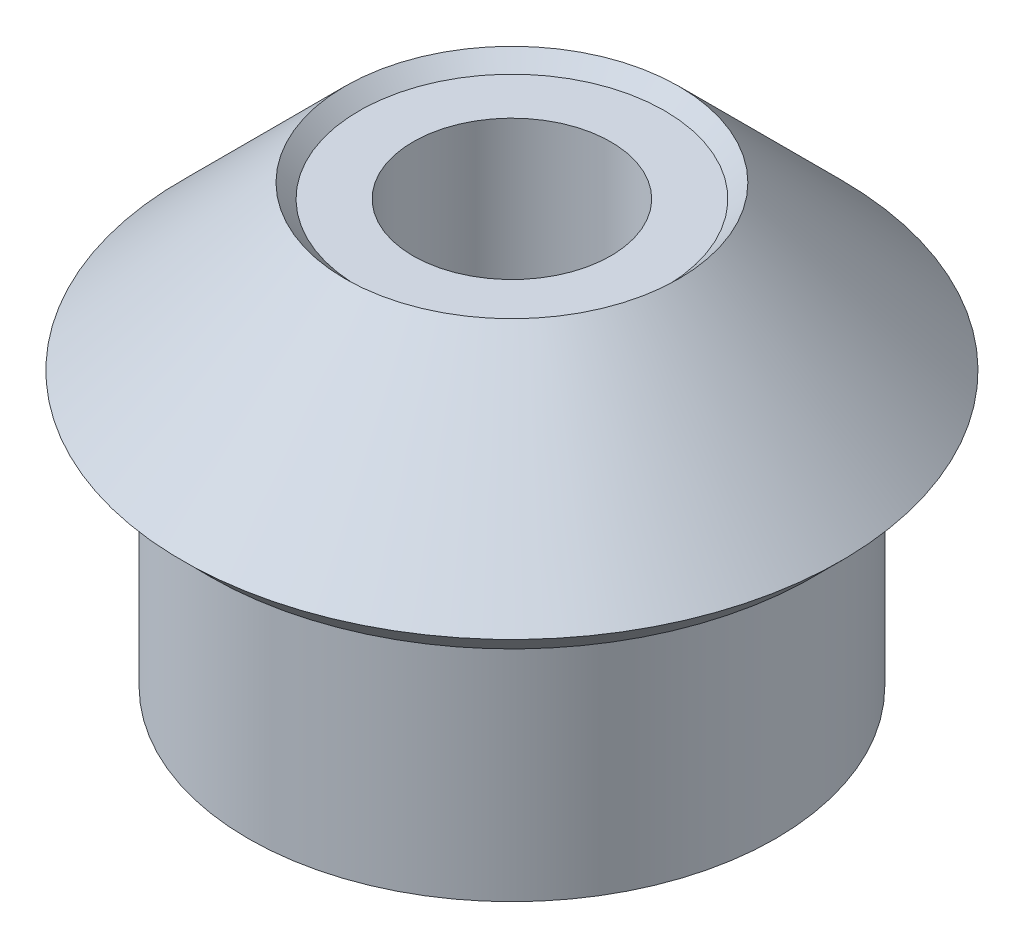
ISO-10303-21;
HEADER;
FILE_DESCRIPTION(('STEP AP214'),'2;1');
FILE_NAME('part.step','',(''),(''),'','','');
FILE_SCHEMA(('AUTOMOTIVE_DESIGN { 1 0 10303 214 1 1 1 1 }'));
ENDSEC;
DATA;
#1=APPLICATION_CONTEXT('core data for automotive mechanical design processes');
#2=APPLICATION_PROTOCOL_DEFINITION('international standard','automotive_design',2000,#1);
#3=PRODUCT_CONTEXT('',#1,'mechanical');
#4=PRODUCT('Part','Part','',(#3));
#5=PRODUCT_RELATED_PRODUCT_CATEGORY('part','',(#4));
#6=PRODUCT_DEFINITION_FORMATION('','',#4);
#7=PRODUCT_DEFINITION_CONTEXT('part definition',#1,'design');
#8=PRODUCT_DEFINITION('design','',#6,#7);
#9=PRODUCT_DEFINITION_SHAPE('','',#8);
#10=(LENGTH_UNIT() NAMED_UNIT(*) SI_UNIT(.MILLI.,.METRE.));
#11=(NAMED_UNIT(*) PLANE_ANGLE_UNIT() SI_UNIT($,.RADIAN.));
#12=(NAMED_UNIT(*) SI_UNIT($,.STERADIAN.) SOLID_ANGLE_UNIT());
#13=UNCERTAINTY_MEASURE_WITH_UNIT(LENGTH_MEASURE(1.E-05),#10,'distance_accuracy_value','');
#14=(GEOMETRIC_REPRESENTATION_CONTEXT(3) GLOBAL_UNCERTAINTY_ASSIGNED_CONTEXT((#13)) GLOBAL_UNIT_ASSIGNED_CONTEXT((#10,
#11,#12)) REPRESENTATION_CONTEXT('',''));
#15=CARTESIAN_POINT('',(0.,0.,0.));
#16=DIRECTION('',(0.,0.,1.));
#17=DIRECTION('',(1.,0.,0.));
#18=AXIS2_PLACEMENT_3D('',#15,#16,#17);
#19=CARTESIAN_POINT('',(0.,12.8124474063216,0.));
#20=DIRECTION('',(0.,1.,0.));
#21=DIRECTION('',(0.,0.,1.));
#22=AXIS2_PLACEMENT_3D('',#19,#20,#21);
#23=PLANE('',#22);
#24=CARTESIAN_POINT('',(0.,12.8124474063216,0.));
#25=DIRECTION('',(0.,1.,0.));
#26=DIRECTION('',(0.,0.,1.));
#27=AXIS2_PLACEMENT_3D('',#24,#25,#26);
#28=CIRCLE('',#27,3.);
#29=CARTESIAN_POINT('',(0.,12.8124474063216,3.));
#30=VERTEX_POINT('',#29);
#31=EDGE_CURVE('E68',#30,#30,#28,.T.);
#32=ORIENTED_EDGE('',*,*,#31,.F.);
#33=EDGE_LOOP('',(#32));
#34=FACE_BOUND('',#33,.T.);
#35=CARTESIAN_POINT('',(0.,12.8124474063216,0.));
#36=DIRECTION('',(0.,-1.,0.));
#37=DIRECTION('',(0.,0.,-1.));
#38=AXIS2_PLACEMENT_3D('',#35,#36,#37);
#39=CIRCLE('',#38,4.63300477017225);
#40=CARTESIAN_POINT('',(0.,12.8124474063216,-4.63300477017225));
#41=VERTEX_POINT('',#40);
#42=EDGE_CURVE('E10',#41,#41,#39,.T.);
#43=ORIENTED_EDGE('',*,*,#42,.F.);
#44=EDGE_LOOP('',(#43));
#45=FACE_BOUND('',#44,.T.);
#46=ADVANCED_FACE('F35',(#34,#45),#23,.T.);
#47=CARTESIAN_POINT('',(0.,13.242021548328,0.));
#48=DIRECTION('',(0.,1.,0.));
#49=DIRECTION('',(0.,0.,1.));
#50=AXIS2_PLACEMENT_3D('',#47,#48,#49);
#51=CONICAL_SURFACE('',#50,5.06257891217864,0.785398163397454);
#52=ORIENTED_EDGE('',*,*,#42,.T.);
#53=EDGE_LOOP('',(#52));
#54=FACE_BOUND('',#53,.T.);
#55=CARTESIAN_POINT('',(0.,13.242021548328,0.));
#56=DIRECTION('',(0.,-1.,0.));
#57=DIRECTION('',(0.,0.,-1.));
#58=AXIS2_PLACEMENT_3D('',#55,#56,#57);
#59=CIRCLE('',#58,5.06257891217864);
#60=CARTESIAN_POINT('',(0.,13.242021548328,-5.06257891217864));
#61=VERTEX_POINT('',#60);
#62=EDGE_CURVE('E42',#61,#61,#59,.T.);
#63=ORIENTED_EDGE('',*,*,#62,.F.);
#64=EDGE_LOOP('',(#63));
#65=FACE_BOUND('',#64,.T.);
#66=ADVANCED_FACE('F86',(#54,#65),#51,.F.);
#67=CARTESIAN_POINT('',(0.,8.30460224169315,0.));
#68=DIRECTION('',(0.,-1.,0.));
#69=DIRECTION('',(0.,0.,-1.));
#70=AXIS2_PLACEMENT_3D('',#67,#68,#69);
#71=CONICAL_SURFACE('',#70,9.99999821881345,0.785398163397443);
#72=ORIENTED_EDGE('',*,*,#62,.T.);
#73=EDGE_LOOP('',(#72));
#74=FACE_BOUND('',#73,.T.);
#75=CARTESIAN_POINT('',(0.,8.30460224169315,0.));
#76=DIRECTION('',(0.,-1.,0.));
#77=DIRECTION('',(0.,0.,-1.));
#78=AXIS2_PLACEMENT_3D('',#75,#76,#77);
#79=CIRCLE('',#78,9.99999821881345);
#80=CARTESIAN_POINT('',(0.,8.30460224169315,-9.99999821881345));
#81=VERTEX_POINT('',#80);
#82=EDGE_CURVE('E48',#81,#81,#79,.T.);
#83=ORIENTED_EDGE('',*,*,#82,.F.);
#84=EDGE_LOOP('',(#83));
#85=FACE_BOUND('',#84,.T.);
#86=ADVANCED_FACE('F90',(#74,#85),#71,.T.);
#87=CARTESIAN_POINT('',(0.,7.4560741042693,0.));
#88=DIRECTION('',(0.,1.,0.));
#89=DIRECTION('',(0.,0.,1.));
#90=AXIS2_PLACEMENT_3D('',#87,#88,#89);
#91=CONICAL_SURFACE('',#90,9.15147008138959,0.785398163397454);
#92=ORIENTED_EDGE('',*,*,#82,.T.);
#93=EDGE_LOOP('',(#92));
#94=FACE_BOUND('',#93,.T.);
#95=CARTESIAN_POINT('',(0.,7.4560741042693,0.));
#96=DIRECTION('',(0.,-1.,0.));
#97=DIRECTION('',(0.,0.,-1.));
#98=AXIS2_PLACEMENT_3D('',#95,#96,#97);
#99=CIRCLE('',#98,9.15147008138959);
#100=CARTESIAN_POINT('',(0.,7.4560741042693,-9.15147008138959));
#101=VERTEX_POINT('',#100);
#102=EDGE_CURVE('E54',#101,#101,#99,.T.);
#103=ORIENTED_EDGE('',*,*,#102,.F.);
#104=EDGE_LOOP('',(#103));
#105=FACE_BOUND('',#104,.T.);
#106=ADVANCED_FACE('F94',(#94,#105),#91,.T.);
#107=CARTESIAN_POINT('',(9.15147008138959,7.4560741042693,0.));
#108=DIRECTION('',(0.,-1.,0.));
#109=DIRECTION('',(0.,0.,-1.));
#110=AXIS2_PLACEMENT_3D('',#107,#108,#109);
#111=PLANE('',#110);
#112=ORIENTED_EDGE('',*,*,#102,.T.);
#113=EDGE_LOOP('',(#112));
#114=FACE_BOUND('',#113,.T.);
#115=CARTESIAN_POINT('',(0.,7.4560741042693,0.));
#116=DIRECTION('',(0.,-1.,0.));
#117=DIRECTION('',(0.,0.,-1.));
#118=AXIS2_PLACEMENT_3D('',#115,#116,#117);
#119=CIRCLE('',#118,8.);
#120=CARTESIAN_POINT('',(0.,7.4560741042693,-8.));
#121=VERTEX_POINT('',#120);
#122=EDGE_CURVE('E60',#121,#121,#119,.T.);
#123=ORIENTED_EDGE('',*,*,#122,.F.);
#124=EDGE_LOOP('',(#123));
#125=FACE_BOUND('',#124,.T.);
#126=ADVANCED_FACE('F100',(#114,#125),#111,.T.);
#127=CARTESIAN_POINT('',(0.,0.,0.));
#128=DIRECTION('',(0.,-1.,0.));
#129=DIRECTION('',(0.,0.,-1.));
#130=AXIS2_PLACEMENT_3D('',#127,#128,#129);
#131=CYLINDRICAL_SURFACE('',#130,8.);
#132=ORIENTED_EDGE('',*,*,#122,.T.);
#133=EDGE_LOOP('',(#132));
#134=FACE_BOUND('',#133,.T.);
#135=CARTESIAN_POINT('',(0.,0.,0.));
#136=DIRECTION('',(0.,-1.,0.));
#137=DIRECTION('',(0.,0.,-1.));
#138=AXIS2_PLACEMENT_3D('',#135,#136,#137);
#139=CIRCLE('',#138,8.);
#140=CARTESIAN_POINT('',(0.,0.,-8.));
#141=VERTEX_POINT('',#140);
#142=EDGE_CURVE('E64',#141,#141,#139,.T.);
#143=ORIENTED_EDGE('',*,*,#142,.F.);
#144=EDGE_LOOP('',(#143));
#145=FACE_BOUND('',#144,.T.);
#146=ADVANCED_FACE('F104',(#134,#145),#131,.T.);
#147=CARTESIAN_POINT('',(8.,0.,0.));
#148=DIRECTION('',(0.,-1.,0.));
#149=DIRECTION('',(0.,0.,-1.));
#150=AXIS2_PLACEMENT_3D('',#147,#148,#149);
#151=PLANE('',#150);
#152=CARTESIAN_POINT('',(0.,0.,0.));
#153=DIRECTION('',(0.,1.,0.));
#154=DIRECTION('',(0.,0.,1.));
#155=AXIS2_PLACEMENT_3D('',#152,#153,#154);
#156=CIRCLE('',#155,3.);
#157=CARTESIAN_POINT('',(0.,0.,3.));
#158=VERTEX_POINT('',#157);
#159=EDGE_CURVE('E67',#158,#158,#156,.T.);
#160=ORIENTED_EDGE('',*,*,#159,.T.);
#161=EDGE_LOOP('',(#160));
#162=FACE_BOUND('',#161,.T.);
#163=ORIENTED_EDGE('',*,*,#142,.T.);
#164=EDGE_LOOP('',(#163));
#165=FACE_BOUND('',#164,.T.);
#166=ADVANCED_FACE('F75',(#162,#165),#151,.T.);
#167=CARTESIAN_POINT('',(0.,0.,0.));
#168=DIRECTION('',(0.,1.,0.));
#169=DIRECTION('',(0.,0.,1.));
#170=AXIS2_PLACEMENT_3D('',#167,#168,#169);
#171=CYLINDRICAL_SURFACE('',#170,3.);
#172=ORIENTED_EDGE('',*,*,#159,.F.);
#173=EDGE_LOOP('',(#172));
#174=FACE_BOUND('',#173,.T.);
#175=ORIENTED_EDGE('',*,*,#31,.T.);
#176=EDGE_LOOP('',(#175));
#177=FACE_BOUND('',#176,.T.);
#178=ADVANCED_FACE('F78',(#174,#177),#171,.F.);
#179=CLOSED_SHELL('',(#46,#66,#86,#106,#126,#146,#166,#178));
#180=MANIFOLD_SOLID_BREP('B2',#179);
#181=ADVANCED_BREP_SHAPE_REPRESENTATION('',(#18,#180),#14);
#182=SHAPE_DEFINITION_REPRESENTATION(#9,#181);
ENDSEC;
END-ISO-10303-21;
